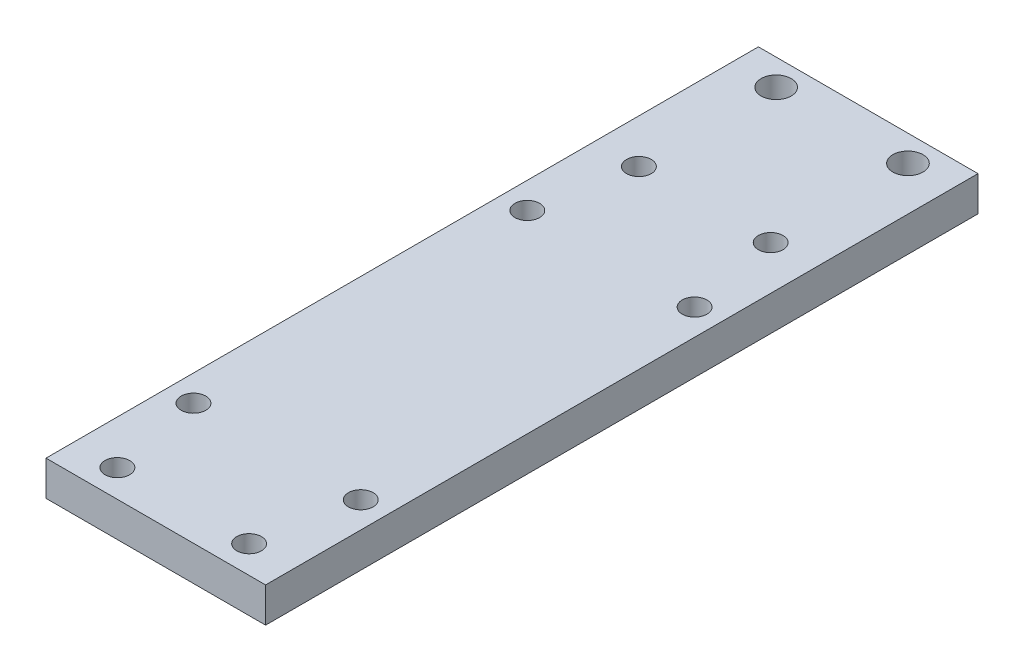
ISO-10303-21;
HEADER;
FILE_DESCRIPTION(('STEP AP214'),'2;1');
FILE_NAME('part.step','',(''),(''),'','','');
FILE_SCHEMA(('AUTOMOTIVE_DESIGN { 1 0 10303 214 1 1 1 1 }'));
ENDSEC;
DATA;
#1=APPLICATION_CONTEXT('core data for automotive mechanical design processes');
#2=APPLICATION_PROTOCOL_DEFINITION('international standard','automotive_design',2000,#1);
#3=PRODUCT_CONTEXT('',#1,'mechanical');
#4=PRODUCT('Part','Part','',(#3));
#5=PRODUCT_RELATED_PRODUCT_CATEGORY('part','',(#4));
#6=PRODUCT_DEFINITION_FORMATION('','',#4);
#7=PRODUCT_DEFINITION_CONTEXT('part definition',#1,'design');
#8=PRODUCT_DEFINITION('design','',#6,#7);
#9=PRODUCT_DEFINITION_SHAPE('','',#8);
#10=(LENGTH_UNIT() NAMED_UNIT(*) SI_UNIT(.MILLI.,.METRE.));
#11=(NAMED_UNIT(*) PLANE_ANGLE_UNIT() SI_UNIT($,.RADIAN.));
#12=(NAMED_UNIT(*) SI_UNIT($,.STERADIAN.) SOLID_ANGLE_UNIT());
#13=UNCERTAINTY_MEASURE_WITH_UNIT(LENGTH_MEASURE(1.E-05),#10,'distance_accuracy_value','');
#14=(GEOMETRIC_REPRESENTATION_CONTEXT(3) GLOBAL_UNCERTAINTY_ASSIGNED_CONTEXT((#13)) GLOBAL_UNIT_ASSIGNED_CONTEXT((#10,
#11,#12)) REPRESENTATION_CONTEXT('',''));
#15=CARTESIAN_POINT('',(0.,0.,0.));
#16=DIRECTION('',(0.,0.,1.));
#17=DIRECTION('',(1.,0.,0.));
#18=AXIS2_PLACEMENT_3D('',#15,#16,#17);
#19=CARTESIAN_POINT('',(20.,3.175,-80.));
#20=DIRECTION('',(-1.,0.,0.));
#21=DIRECTION('',(0.,0.,1.));
#22=AXIS2_PLACEMENT_3D('',#19,#20,#21);
#23=PLANE('',#22);
#24=DIRECTION('',(0.,0.,-1.));
#25=VECTOR('',#24,1.);
#26=CARTESIAN_POINT('',(20.,3.175,-80.));
#27=LINE('',#26,#25);
#28=CARTESIAN_POINT('',(20.,3.175,49.7625));
#29=VERTEX_POINT('',#28);
#30=CARTESIAN_POINT('',(20.,3.175,-80.));
#31=VERTEX_POINT('',#30);
#32=EDGE_CURVE('E85',#29,#31,#27,.T.);
#33=ORIENTED_EDGE('',*,*,#32,.F.);
#34=DIRECTION('',(0.,1.,0.));
#35=VECTOR('',#34,1.);
#36=CARTESIAN_POINT('',(20.,-53.3178599727818,49.7625));
#37=LINE('',#36,#35);
#38=CARTESIAN_POINT('',(20.,-3.175,49.7625));
#39=VERTEX_POINT('',#38);
#40=EDGE_CURVE('E158',#39,#29,#37,.T.);
#41=ORIENTED_EDGE('',*,*,#40,.F.);
#42=DIRECTION('',(0.,0.,-1.));
#43=VECTOR('',#42,1.);
#44=CARTESIAN_POINT('',(20.,-3.175,-80.));
#45=LINE('',#44,#43);
#46=CARTESIAN_POINT('',(20.,-3.175,-80.));
#47=VERTEX_POINT('',#46);
#48=EDGE_CURVE('E77',#39,#47,#45,.T.);
#49=ORIENTED_EDGE('',*,*,#48,.T.);
#50=DIRECTION('',(0.,-1.,0.));
#51=VECTOR('',#50,1.);
#52=CARTESIAN_POINT('',(20.,3.175,-80.));
#53=LINE('',#52,#51);
#54=EDGE_CURVE('E11',#31,#47,#53,.T.);
#55=ORIENTED_EDGE('',*,*,#54,.F.);
#56=EDGE_LOOP('',(#33,#41,#49,#55));
#57=FACE_BOUND('',#56,.T.);
#58=ADVANCED_FACE('F33',(#57),#23,.F.);
#59=CARTESIAN_POINT('',(-20.,3.175,-80.));
#60=DIRECTION('',(0.,0.,1.));
#61=DIRECTION('',(1.,0.,0.));
#62=AXIS2_PLACEMENT_3D('',#59,#60,#61);
#63=PLANE('',#62);
#64=CARTESIAN_POINT('',(0.,0.,-80.));
#65=DIRECTION('',(0.,0.,-1.));
#66=DIRECTION('',(-1.,0.,0.));
#67=AXIS2_PLACEMENT_3D('',#64,#65,#66);
#68=CIRCLE('',#67,1.5);
#69=CARTESIAN_POINT('',(-1.5,0.,-80.));
#70=VERTEX_POINT('',#69);
#71=EDGE_CURVE('E129',#70,#70,#68,.T.);
#72=ORIENTED_EDGE('',*,*,#71,.F.);
#73=EDGE_LOOP('',(#72));
#74=FACE_BOUND('',#73,.T.);
#75=DIRECTION('',(-1.,0.,0.));
#76=VECTOR('',#75,1.);
#77=CARTESIAN_POINT('',(-20.,-3.175,-80.));
#78=LINE('',#77,#76);
#79=CARTESIAN_POINT('',(-20.,-3.175,-80.));
#80=VERTEX_POINT('',#79);
#81=EDGE_CURVE('E68',#47,#80,#78,.T.);
#82=ORIENTED_EDGE('',*,*,#81,.T.);
#83=DIRECTION('',(0.,-1.,0.));
#84=VECTOR('',#83,1.);
#85=CARTESIAN_POINT('',(-20.,3.175,-80.));
#86=LINE('',#85,#84);
#87=CARTESIAN_POINT('',(-20.,3.175,-80.));
#88=VERTEX_POINT('',#87);
#89=EDGE_CURVE('E40',#88,#80,#86,.T.);
#90=ORIENTED_EDGE('',*,*,#89,.F.);
#91=DIRECTION('',(-1.,0.,0.));
#92=VECTOR('',#91,1.);
#93=CARTESIAN_POINT('',(-20.,3.175,-80.));
#94=LINE('',#93,#92);
#95=EDGE_CURVE('E56',#31,#88,#94,.T.);
#96=ORIENTED_EDGE('',*,*,#95,.F.);
#97=ORIENTED_EDGE('',*,*,#54,.T.);
#98=EDGE_LOOP('',(#82,#90,#96,#97));
#99=FACE_BOUND('',#98,.T.);
#100=ADVANCED_FACE('F70',(#74,#99),#63,.F.);
#101=CARTESIAN_POINT('',(-20.,3.175,-80.));
#102=DIRECTION('',(1.,0.,0.));
#103=DIRECTION('',(0.,0.,-1.));
#104=AXIS2_PLACEMENT_3D('',#101,#102,#103);
#105=PLANE('',#104);
#106=DIRECTION('',(0.,0.,1.));
#107=VECTOR('',#106,1.);
#108=CARTESIAN_POINT('',(-20.,-3.175,-80.));
#109=LINE('',#108,#107);
#110=CARTESIAN_POINT('',(-20.,-3.175,49.7625));
#111=VERTEX_POINT('',#110);
#112=EDGE_CURVE('E76',#80,#111,#109,.T.);
#113=ORIENTED_EDGE('',*,*,#112,.T.);
#114=DIRECTION('',(0.,1.,0.));
#115=VECTOR('',#114,1.);
#116=CARTESIAN_POINT('',(-20.,-53.3178599727818,49.7625));
#117=LINE('',#116,#115);
#118=CARTESIAN_POINT('',(-20.,3.175,49.7625));
#119=VERTEX_POINT('',#118);
#120=EDGE_CURVE('E47',#111,#119,#117,.T.);
#121=ORIENTED_EDGE('',*,*,#120,.T.);
#122=DIRECTION('',(0.,0.,1.));
#123=VECTOR('',#122,1.);
#124=CARTESIAN_POINT('',(-20.,3.175,-80.));
#125=LINE('',#124,#123);
#126=EDGE_CURVE('E82',#88,#119,#125,.T.);
#127=ORIENTED_EDGE('',*,*,#126,.F.);
#128=ORIENTED_EDGE('',*,*,#89,.T.);
#129=EDGE_LOOP('',(#113,#121,#127,#128));
#130=FACE_BOUND('',#129,.T.);
#131=ADVANCED_FACE('F81',(#130),#105,.F.);
#132=CARTESIAN_POINT('',(0.,3.175,0.));
#133=DIRECTION('',(0.,1.,0.));
#134=DIRECTION('',(0.,0.,1.));
#135=AXIS2_PLACEMENT_3D('',#132,#133,#134);
#136=PLANE('',#135);
#137=DIRECTION('',(-1.,0.,0.));
#138=VECTOR('',#137,1.);
#139=CARTESIAN_POINT('',(-20.,3.175,49.7625));
#140=LINE('',#139,#138);
#141=EDGE_CURVE('E161',#29,#119,#140,.T.);
#142=ORIENTED_EDGE('',*,*,#141,.F.);
#143=ORIENTED_EDGE('',*,*,#32,.T.);
#144=ORIENTED_EDGE('',*,*,#95,.T.);
#145=ORIENTED_EDGE('',*,*,#126,.T.);
#146=EDGE_LOOP('',(#142,#143,#144,#145));
#147=FACE_BOUND('',#146,.T.);
#148=CARTESIAN_POINT('',(-15.2375,3.175,-33.1375));
#149=DIRECTION('',(0.,1.,0.));
#150=DIRECTION('',(0.,0.,-1.));
#151=AXIS2_PLACEMENT_3D('',#148,#149,#150);
#152=CIRCLE('',#151,2.25);
#153=CARTESIAN_POINT('',(-15.2375,3.175,-35.3875));
#154=VERTEX_POINT('',#153);
#155=EDGE_CURVE('E145',#154,#154,#152,.T.);
#156=ORIENTED_EDGE('',*,*,#155,.F.);
#157=EDGE_LOOP('',(#156));
#158=FACE_BOUND('',#157,.T.);
#159=CARTESIAN_POINT('',(15.2375,3.175,-33.1375));
#160=DIRECTION('',(0.,1.,0.));
#161=DIRECTION('',(0.,0.,1.));
#162=AXIS2_PLACEMENT_3D('',#159,#160,#161);
#163=CIRCLE('',#162,2.25);
#164=CARTESIAN_POINT('',(15.2375,3.175,-30.8875));
#165=VERTEX_POINT('',#164);
#166=EDGE_CURVE('E144',#165,#165,#163,.T.);
#167=ORIENTED_EDGE('',*,*,#166,.F.);
#168=EDGE_LOOP('',(#167));
#169=FACE_BOUND('',#168,.T.);
#170=CARTESIAN_POINT('',(15.2375,3.175,27.6625));
#171=DIRECTION('',(0.,1.,0.));
#172=DIRECTION('',(0.,0.,-1.));
#173=AXIS2_PLACEMENT_3D('',#170,#171,#172);
#174=CIRCLE('',#173,2.25);
#175=CARTESIAN_POINT('',(15.2375,3.175,25.4125));
#176=VERTEX_POINT('',#175);
#177=EDGE_CURVE('E151',#176,#176,#174,.T.);
#178=ORIENTED_EDGE('',*,*,#177,.F.);
#179=EDGE_LOOP('',(#178));
#180=FACE_BOUND('',#179,.T.);
#181=CARTESIAN_POINT('',(-15.2375,3.175,27.6625));
#182=DIRECTION('',(0.,1.,0.));
#183=DIRECTION('',(0.,0.,1.));
#184=AXIS2_PLACEMENT_3D('',#181,#182,#183);
#185=CIRCLE('',#184,2.25);
#186=CARTESIAN_POINT('',(-15.2375,3.175,29.9125));
#187=VERTEX_POINT('',#186);
#188=EDGE_CURVE('E137',#187,#187,#185,.T.);
#189=ORIENTED_EDGE('',*,*,#188,.F.);
#190=EDGE_LOOP('',(#189));
#191=FACE_BOUND('',#190,.T.);
#192=CARTESIAN_POINT('',(12.0000000000023,3.175,44.7625));
#193=DIRECTION('',(0.,1.,0.));
#194=DIRECTION('',(0.,0.,1.));
#195=AXIS2_PLACEMENT_3D('',#192,#193,#194);
#196=CIRCLE('',#195,2.25);
#197=CARTESIAN_POINT('',(12.0000000000023,3.175,47.0125));
#198=VERTEX_POINT('',#197);
#199=EDGE_CURVE('E90',#198,#198,#196,.F.);
#200=ORIENTED_EDGE('',*,*,#199,.T.);
#201=EDGE_LOOP('',(#200));
#202=FACE_BOUND('',#201,.T.);
#203=CARTESIAN_POINT('',(-12.,3.175,-75.2375));
#204=DIRECTION('',(0.,1.,0.));
#205=DIRECTION('',(0.,0.,1.));
#206=AXIS2_PLACEMENT_3D('',#203,#204,#205);
#207=CIRCLE('',#206,2.75);
#208=CARTESIAN_POINT('',(-12.,3.175,-72.4875));
#209=VERTEX_POINT('',#208);
#210=EDGE_CURVE('E95',#209,#209,#207,.F.);
#211=ORIENTED_EDGE('',*,*,#210,.T.);
#212=EDGE_LOOP('',(#211));
#213=FACE_BOUND('',#212,.T.);
#214=CARTESIAN_POINT('',(12.,3.175,-75.2375));
#215=DIRECTION('',(0.,1.,0.));
#216=DIRECTION('',(0.,0.,1.));
#217=AXIS2_PLACEMENT_3D('',#214,#215,#216);
#218=CIRCLE('',#217,2.75);
#219=CARTESIAN_POINT('',(12.,3.175,-72.4875));
#220=VERTEX_POINT('',#219);
#221=EDGE_CURVE('E98',#220,#220,#218,.F.);
#222=ORIENTED_EDGE('',*,*,#221,.T.);
#223=EDGE_LOOP('',(#222));
#224=FACE_BOUND('',#223,.T.);
#225=CARTESIAN_POINT('',(-12.,3.175,-50.2375));
#226=DIRECTION('',(0.,1.,0.));
#227=DIRECTION('',(0.,0.,1.));
#228=AXIS2_PLACEMENT_3D('',#225,#226,#227);
#229=CIRCLE('',#228,2.25);
#230=CARTESIAN_POINT('',(-12.,3.175,-47.9875));
#231=VERTEX_POINT('',#230);
#232=EDGE_CURVE('E101',#231,#231,#229,.F.);
#233=ORIENTED_EDGE('',*,*,#232,.T.);
#234=EDGE_LOOP('',(#233));
#235=FACE_BOUND('',#234,.T.);
#236=CARTESIAN_POINT('',(-11.9999999999977,3.175,44.7625));
#237=DIRECTION('',(0.,1.,0.));
#238=DIRECTION('',(0.,0.,1.));
#239=AXIS2_PLACEMENT_3D('',#236,#237,#238);
#240=CIRCLE('',#239,2.25);
#241=CARTESIAN_POINT('',(-11.9999999999977,3.175,47.0125));
#242=VERTEX_POINT('',#241);
#243=EDGE_CURVE('E104',#242,#242,#240,.F.);
#244=ORIENTED_EDGE('',*,*,#243,.T.);
#245=EDGE_LOOP('',(#244));
#246=FACE_BOUND('',#245,.T.);
#247=CARTESIAN_POINT('',(12.,3.175,-50.2375));
#248=DIRECTION('',(0.,1.,0.));
#249=DIRECTION('',(0.,0.,1.));
#250=AXIS2_PLACEMENT_3D('',#247,#248,#249);
#251=CIRCLE('',#250,2.25);
#252=CARTESIAN_POINT('',(12.,3.175,-47.9875));
#253=VERTEX_POINT('',#252);
#254=EDGE_CURVE('E107',#253,#253,#251,.F.);
#255=ORIENTED_EDGE('',*,*,#254,.T.);
#256=EDGE_LOOP('',(#255));
#257=FACE_BOUND('',#256,.T.);
#258=ADVANCED_FACE('F172',(#147,#158,#169,#180,#191,#202,#213,#224,#235,#246,#257),#136,.T.);
#259=CARTESIAN_POINT('',(0.,-3.175,0.));
#260=DIRECTION('',(0.,1.,0.));
#261=DIRECTION('',(0.,0.,1.));
#262=AXIS2_PLACEMENT_3D('',#259,#260,#261);
#263=PLANE('',#262);
#264=CARTESIAN_POINT('',(-15.2375,-3.175,-33.1375));
#265=DIRECTION('',(0.,1.,0.));
#266=DIRECTION('',(0.,0.,1.));
#267=AXIS2_PLACEMENT_3D('',#264,#265,#266);
#268=CIRCLE('',#267,2.25);
#269=CARTESIAN_POINT('',(-15.2375,-3.175,-30.8875));
#270=VERTEX_POINT('',#269);
#271=EDGE_CURVE('E141',#270,#270,#268,.F.);
#272=ORIENTED_EDGE('',*,*,#271,.F.);
#273=EDGE_LOOP('',(#272));
#274=FACE_BOUND('',#273,.T.);
#275=CARTESIAN_POINT('',(15.2375,-3.175,-33.1375));
#276=DIRECTION('',(0.,1.,0.));
#277=DIRECTION('',(0.,0.,1.));
#278=AXIS2_PLACEMENT_3D('',#275,#276,#277);
#279=CIRCLE('',#278,2.25);
#280=CARTESIAN_POINT('',(15.2375,-3.175,-30.8875));
#281=VERTEX_POINT('',#280);
#282=EDGE_CURVE('E148',#281,#281,#279,.F.);
#283=ORIENTED_EDGE('',*,*,#282,.F.);
#284=EDGE_LOOP('',(#283));
#285=FACE_BOUND('',#284,.T.);
#286=CARTESIAN_POINT('',(15.2375,-3.175,27.6625));
#287=DIRECTION('',(0.,1.,0.));
#288=DIRECTION('',(0.,0.,1.));
#289=AXIS2_PLACEMENT_3D('',#286,#287,#288);
#290=CIRCLE('',#289,2.25);
#291=CARTESIAN_POINT('',(15.2375,-3.175,29.9125));
#292=VERTEX_POINT('',#291);
#293=EDGE_CURVE('E140',#292,#292,#290,.F.);
#294=ORIENTED_EDGE('',*,*,#293,.F.);
#295=EDGE_LOOP('',(#294));
#296=FACE_BOUND('',#295,.T.);
#297=CARTESIAN_POINT('',(-15.2375,-3.175,27.6625));
#298=DIRECTION('',(0.,1.,0.));
#299=DIRECTION('',(0.,0.,1.));
#300=AXIS2_PLACEMENT_3D('',#297,#298,#299);
#301=CIRCLE('',#300,2.25);
#302=CARTESIAN_POINT('',(-15.2375,-3.175,29.9125));
#303=VERTEX_POINT('',#302);
#304=EDGE_CURVE('E132',#303,#303,#301,.F.);
#305=ORIENTED_EDGE('',*,*,#304,.F.);
#306=EDGE_LOOP('',(#305));
#307=FACE_BOUND('',#306,.T.);
#308=CARTESIAN_POINT('',(12.0000000000023,-3.175,44.7625));
#309=DIRECTION('',(0.,1.,0.));
#310=DIRECTION('',(0.,0.,1.));
#311=AXIS2_PLACEMENT_3D('',#308,#309,#310);
#312=CIRCLE('',#311,2.25);
#313=CARTESIAN_POINT('',(12.0000000000023,-3.175,47.0125));
#314=VERTEX_POINT('',#313);
#315=EDGE_CURVE('E120',#314,#314,#312,.F.);
#316=ORIENTED_EDGE('',*,*,#315,.F.);
#317=EDGE_LOOP('',(#316));
#318=FACE_BOUND('',#317,.T.);
#319=CARTESIAN_POINT('',(-12.,-3.175,-75.2375));
#320=DIRECTION('',(0.,1.,0.));
#321=DIRECTION('',(0.,0.,1.));
#322=AXIS2_PLACEMENT_3D('',#319,#320,#321);
#323=CIRCLE('',#322,2.75);
#324=CARTESIAN_POINT('',(-12.,-3.175,-72.4875));
#325=VERTEX_POINT('',#324);
#326=EDGE_CURVE('E117',#325,#325,#323,.F.);
#327=ORIENTED_EDGE('',*,*,#326,.F.);
#328=EDGE_LOOP('',(#327));
#329=FACE_BOUND('',#328,.T.);
#330=CARTESIAN_POINT('',(12.,-3.175,-75.2375));
#331=DIRECTION('',(0.,1.,0.));
#332=DIRECTION('',(0.,0.,1.));
#333=AXIS2_PLACEMENT_3D('',#330,#331,#332);
#334=CIRCLE('',#333,2.75);
#335=CARTESIAN_POINT('',(12.,-3.175,-72.4875));
#336=VERTEX_POINT('',#335);
#337=EDGE_CURVE('E114',#336,#336,#334,.F.);
#338=ORIENTED_EDGE('',*,*,#337,.F.);
#339=EDGE_LOOP('',(#338));
#340=FACE_BOUND('',#339,.T.);
#341=CARTESIAN_POINT('',(-12.,-3.175,-50.2375));
#342=DIRECTION('',(0.,1.,0.));
#343=DIRECTION('',(0.,0.,1.));
#344=AXIS2_PLACEMENT_3D('',#341,#342,#343);
#345=CIRCLE('',#344,2.25);
#346=CARTESIAN_POINT('',(-12.,-3.175,-47.9875));
#347=VERTEX_POINT('',#346);
#348=EDGE_CURVE('E113',#347,#347,#345,.F.);
#349=ORIENTED_EDGE('',*,*,#348,.F.);
#350=EDGE_LOOP('',(#349));
#351=FACE_BOUND('',#350,.T.);
#352=CARTESIAN_POINT('',(-11.9999999999977,-3.175,44.7625));
#353=DIRECTION('',(0.,1.,0.));
#354=DIRECTION('',(0.,0.,1.));
#355=AXIS2_PLACEMENT_3D('',#352,#353,#354);
#356=CIRCLE('',#355,2.25);
#357=CARTESIAN_POINT('',(-11.9999999999977,-3.175,47.0125));
#358=VERTEX_POINT('',#357);
#359=EDGE_CURVE('E123',#358,#358,#356,.F.);
#360=ORIENTED_EDGE('',*,*,#359,.F.);
#361=EDGE_LOOP('',(#360));
#362=FACE_BOUND('',#361,.T.);
#363=CARTESIAN_POINT('',(12.,-3.175,-50.2375));
#364=DIRECTION('',(0.,1.,0.));
#365=DIRECTION('',(0.,0.,1.));
#366=AXIS2_PLACEMENT_3D('',#363,#364,#365);
#367=CIRCLE('',#366,2.25);
#368=CARTESIAN_POINT('',(12.,-3.175,-47.9875));
#369=VERTEX_POINT('',#368);
#370=EDGE_CURVE('E110',#369,#369,#367,.F.);
#371=ORIENTED_EDGE('',*,*,#370,.F.);
#372=EDGE_LOOP('',(#371));
#373=FACE_BOUND('',#372,.T.);
#374=ORIENTED_EDGE('',*,*,#48,.F.);
#375=DIRECTION('',(1.,0.,0.));
#376=VECTOR('',#375,1.);
#377=CARTESIAN_POINT('',(-20.,-3.175,49.7625));
#378=LINE('',#377,#376);
#379=EDGE_CURVE('E84',#111,#39,#378,.T.);
#380=ORIENTED_EDGE('',*,*,#379,.F.);
#381=ORIENTED_EDGE('',*,*,#112,.F.);
#382=ORIENTED_EDGE('',*,*,#81,.F.);
#383=EDGE_LOOP('',(#374,#380,#381,#382));
#384=FACE_BOUND('',#383,.T.);
#385=ADVANCED_FACE('F83',(#274,#285,#296,#307,#318,#329,#340,#351,#362,#373,#384),#263,.F.);
#386=CARTESIAN_POINT('',(12.,6.35,-50.2375));
#387=DIRECTION('',(0.,-1.,0.));
#388=DIRECTION('',(0.,0.,-1.));
#389=AXIS2_PLACEMENT_3D('',#386,#387,#388);
#390=CYLINDRICAL_SURFACE('',#389,2.25);
#391=ORIENTED_EDGE('',*,*,#254,.F.);
#392=EDGE_LOOP('',(#391));
#393=FACE_BOUND('',#392,.T.);
#394=ORIENTED_EDGE('',*,*,#370,.T.);
#395=EDGE_LOOP('',(#394));
#396=FACE_BOUND('',#395,.T.);
#397=ADVANCED_FACE('F197',(#393,#396),#390,.F.);
#398=CARTESIAN_POINT('',(-11.9999999999977,6.35,44.7625));
#399=DIRECTION('',(0.,-1.,0.));
#400=DIRECTION('',(0.,0.,-1.));
#401=AXIS2_PLACEMENT_3D('',#398,#399,#400);
#402=CYLINDRICAL_SURFACE('',#401,2.25);
#403=ORIENTED_EDGE('',*,*,#243,.F.);
#404=EDGE_LOOP('',(#403));
#405=FACE_BOUND('',#404,.T.);
#406=ORIENTED_EDGE('',*,*,#359,.T.);
#407=EDGE_LOOP('',(#406));
#408=FACE_BOUND('',#407,.T.);
#409=ADVANCED_FACE('F200',(#405,#408),#402,.F.);
#410=CARTESIAN_POINT('',(-12.,6.35,-50.2375));
#411=DIRECTION('',(0.,-1.,0.));
#412=DIRECTION('',(0.,0.,-1.));
#413=AXIS2_PLACEMENT_3D('',#410,#411,#412);
#414=CYLINDRICAL_SURFACE('',#413,2.25);
#415=ORIENTED_EDGE('',*,*,#232,.F.);
#416=EDGE_LOOP('',(#415));
#417=FACE_BOUND('',#416,.T.);
#418=ORIENTED_EDGE('',*,*,#348,.T.);
#419=EDGE_LOOP('',(#418));
#420=FACE_BOUND('',#419,.T.);
#421=ADVANCED_FACE('F243',(#417,#420),#414,.F.);
#422=CARTESIAN_POINT('',(12.,6.35,-75.2375));
#423=DIRECTION('',(0.,-1.,0.));
#424=DIRECTION('',(0.,0.,-1.));
#425=AXIS2_PLACEMENT_3D('',#422,#423,#424);
#426=CYLINDRICAL_SURFACE('',#425,2.75);
#427=ORIENTED_EDGE('',*,*,#221,.F.);
#428=EDGE_LOOP('',(#427));
#429=FACE_BOUND('',#428,.T.);
#430=ORIENTED_EDGE('',*,*,#337,.T.);
#431=EDGE_LOOP('',(#430));
#432=FACE_BOUND('',#431,.T.);
#433=ADVANCED_FACE('F246',(#429,#432),#426,.F.);
#434=CARTESIAN_POINT('',(-12.,6.35,-75.2375));
#435=DIRECTION('',(0.,-1.,0.));
#436=DIRECTION('',(0.,0.,-1.));
#437=AXIS2_PLACEMENT_3D('',#434,#435,#436);
#438=CYLINDRICAL_SURFACE('',#437,2.75);
#439=ORIENTED_EDGE('',*,*,#210,.F.);
#440=EDGE_LOOP('',(#439));
#441=FACE_BOUND('',#440,.T.);
#442=ORIENTED_EDGE('',*,*,#326,.T.);
#443=EDGE_LOOP('',(#442));
#444=FACE_BOUND('',#443,.T.);
#445=ADVANCED_FACE('F235',(#441,#444),#438,.F.);
#446=CARTESIAN_POINT('',(12.0000000000023,6.35,44.7625));
#447=DIRECTION('',(0.,-1.,0.));
#448=DIRECTION('',(0.,0.,-1.));
#449=AXIS2_PLACEMENT_3D('',#446,#447,#448);
#450=CYLINDRICAL_SURFACE('',#449,2.25);
#451=ORIENTED_EDGE('',*,*,#199,.F.);
#452=EDGE_LOOP('',(#451));
#453=FACE_BOUND('',#452,.T.);
#454=ORIENTED_EDGE('',*,*,#315,.T.);
#455=EDGE_LOOP('',(#454));
#456=FACE_BOUND('',#455,.T.);
#457=ADVANCED_FACE('F225',(#453,#456),#450,.F.);
#458=CARTESIAN_POINT('',(0.,0.,-72.));
#459=DIRECTION('',(0.,0.,-1.));
#460=DIRECTION('',(-1.,0.,0.));
#461=AXIS2_PLACEMENT_3D('',#458,#459,#460);
#462=CYLINDRICAL_SURFACE('',#461,1.5);
#463=CARTESIAN_POINT('',(0.,0.,-72.));
#464=DIRECTION('',(0.,0.,-1.));
#465=DIRECTION('',(-1.,0.,0.));
#466=AXIS2_PLACEMENT_3D('',#463,#464,#465);
#467=CIRCLE('',#466,1.5);
#468=CARTESIAN_POINT('',(-1.5,0.,-72.));
#469=VERTEX_POINT('',#468);
#470=EDGE_CURVE('E128',#469,#469,#467,.T.);
#471=ORIENTED_EDGE('',*,*,#470,.F.);
#472=EDGE_LOOP('',(#471));
#473=FACE_BOUND('',#472,.T.);
#474=ORIENTED_EDGE('',*,*,#71,.T.);
#475=EDGE_LOOP('',(#474));
#476=FACE_BOUND('',#475,.T.);
#477=ADVANCED_FACE('F222',(#473,#476),#462,.F.);
#478=CARTESIAN_POINT('',(0.,0.,-72.));
#479=DIRECTION('',(0.,0.,-1.));
#480=DIRECTION('',(-1.,0.,0.));
#481=AXIS2_PLACEMENT_3D('',#478,#479,#480);
#482=PLANE('',#481);
#483=ORIENTED_EDGE('',*,*,#470,.T.);
#484=EDGE_LOOP('',(#483));
#485=FACE_BOUND('',#484,.T.);
#486=ADVANCED_FACE('F224',(#485),#482,.T.);
#487=CARTESIAN_POINT('',(-15.2375,-9.53896103067893,27.6625));
#488=DIRECTION('',(0.,1.,0.));
#489=DIRECTION('',(0.,0.,1.));
#490=AXIS2_PLACEMENT_3D('',#487,#488,#489);
#491=CYLINDRICAL_SURFACE('',#490,2.25);
#492=ORIENTED_EDGE('',*,*,#304,.T.);
#493=EDGE_LOOP('',(#492));
#494=FACE_BOUND('',#493,.T.);
#495=ORIENTED_EDGE('',*,*,#188,.T.);
#496=EDGE_LOOP('',(#495));
#497=FACE_BOUND('',#496,.T.);
#498=ADVANCED_FACE('F232',(#494,#497),#491,.F.);
#499=CARTESIAN_POINT('',(15.2375,-9.53896103067893,27.6625));
#500=DIRECTION('',(0.,1.,0.));
#501=DIRECTION('',(0.,0.,1.));
#502=AXIS2_PLACEMENT_3D('',#499,#500,#501);
#503=CYLINDRICAL_SURFACE('',#502,2.25);
#504=ORIENTED_EDGE('',*,*,#293,.T.);
#505=EDGE_LOOP('',(#504));
#506=FACE_BOUND('',#505,.T.);
#507=ORIENTED_EDGE('',*,*,#177,.T.);
#508=EDGE_LOOP('',(#507));
#509=FACE_BOUND('',#508,.T.);
#510=ADVANCED_FACE('F300',(#506,#509),#503,.F.);
#511=CARTESIAN_POINT('',(15.2375,-9.53896103067893,-33.1375));
#512=DIRECTION('',(0.,1.,0.));
#513=DIRECTION('',(0.,0.,1.));
#514=AXIS2_PLACEMENT_3D('',#511,#512,#513);
#515=CYLINDRICAL_SURFACE('',#514,2.25);
#516=ORIENTED_EDGE('',*,*,#282,.T.);
#517=EDGE_LOOP('',(#516));
#518=FACE_BOUND('',#517,.T.);
#519=ORIENTED_EDGE('',*,*,#166,.T.);
#520=EDGE_LOOP('',(#519));
#521=FACE_BOUND('',#520,.T.);
#522=ADVANCED_FACE('F309',(#518,#521),#515,.F.);
#523=CARTESIAN_POINT('',(-15.2375,-9.53896103067893,-33.1375));
#524=DIRECTION('',(0.,1.,0.));
#525=DIRECTION('',(0.,0.,1.));
#526=AXIS2_PLACEMENT_3D('',#523,#524,#525);
#527=CYLINDRICAL_SURFACE('',#526,2.25);
#528=ORIENTED_EDGE('',*,*,#271,.T.);
#529=EDGE_LOOP('',(#528));
#530=FACE_BOUND('',#529,.T.);
#531=ORIENTED_EDGE('',*,*,#155,.T.);
#532=EDGE_LOOP('',(#531));
#533=FACE_BOUND('',#532,.T.);
#534=ADVANCED_FACE('F319',(#530,#533),#527,.F.);
#535=CARTESIAN_POINT('',(-20.,-53.3178599727818,49.7625));
#536=DIRECTION('',(0.,0.,-1.));
#537=DIRECTION('',(-1.,0.,0.));
#538=AXIS2_PLACEMENT_3D('',#535,#536,#537);
#539=PLANE('',#538);
#540=ORIENTED_EDGE('',*,*,#379,.T.);
#541=ORIENTED_EDGE('',*,*,#40,.T.);
#542=ORIENTED_EDGE('',*,*,#141,.T.);
#543=ORIENTED_EDGE('',*,*,#120,.F.);
#544=EDGE_LOOP('',(#540,#541,#542,#543));
#545=FACE_BOUND('',#544,.T.);
#546=ADVANCED_FACE('F165',(#545),#539,.F.);
#547=CLOSED_SHELL('',(#58,#100,#131,#258,#385,#397,#409,#421,#433,#445,#457,#477,#486,#498,#510,
#522,#534,#546));
#548=MANIFOLD_SOLID_BREP('B2',#547);
#549=ADVANCED_BREP_SHAPE_REPRESENTATION('',(#18,#548),#14);
#550=SHAPE_DEFINITION_REPRESENTATION(#9,#549);
ENDSEC;
END-ISO-10303-21;
